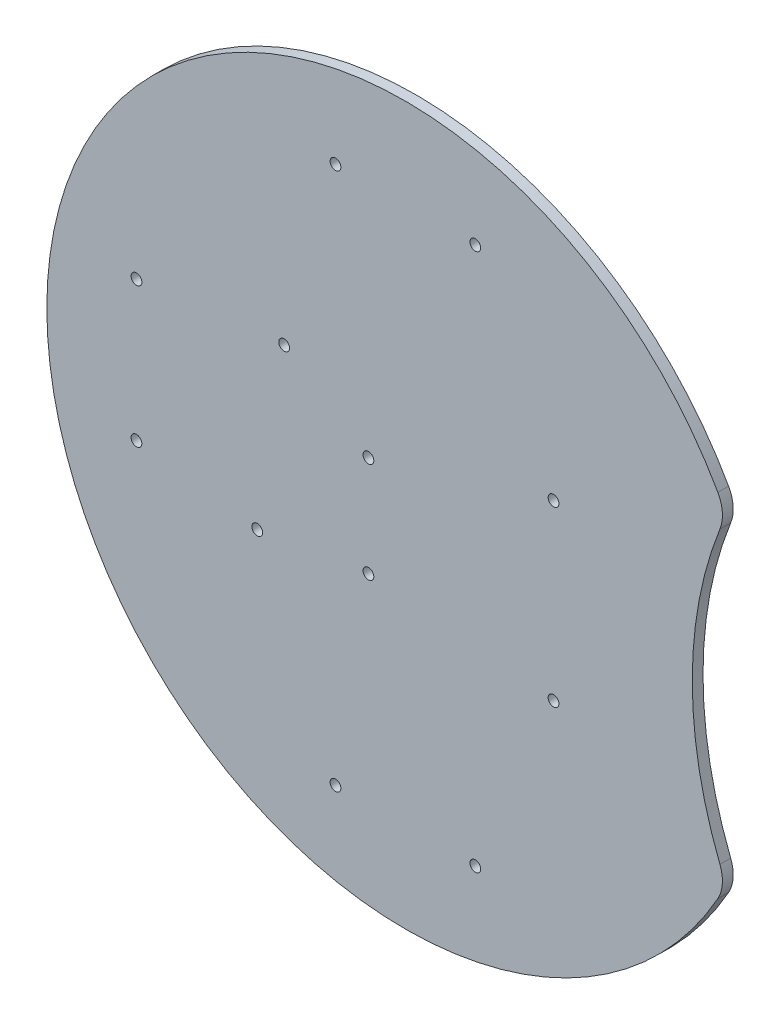
ISO-10303-21;
HEADER;
FILE_DESCRIPTION(('STEP AP214'),'2;1');
FILE_NAME('part.step','',(''),(''),'','','');
FILE_SCHEMA(('AUTOMOTIVE_DESIGN { 1 0 10303 214 1 1 1 1 }'));
ENDSEC;
DATA;
#1=APPLICATION_CONTEXT('core data for automotive mechanical design processes');
#2=APPLICATION_PROTOCOL_DEFINITION('international standard','automotive_design',2000,#1);
#3=PRODUCT_CONTEXT('',#1,'mechanical');
#4=PRODUCT('Part','Part','',(#3));
#5=PRODUCT_RELATED_PRODUCT_CATEGORY('part','',(#4));
#6=PRODUCT_DEFINITION_FORMATION('','',#4);
#7=PRODUCT_DEFINITION_CONTEXT('part definition',#1,'design');
#8=PRODUCT_DEFINITION('design','',#6,#7);
#9=PRODUCT_DEFINITION_SHAPE('','',#8);
#10=(LENGTH_UNIT() NAMED_UNIT(*) SI_UNIT(.MILLI.,.METRE.));
#11=(NAMED_UNIT(*) PLANE_ANGLE_UNIT() SI_UNIT($,.RADIAN.));
#12=(NAMED_UNIT(*) SI_UNIT($,.STERADIAN.) SOLID_ANGLE_UNIT());
#13=UNCERTAINTY_MEASURE_WITH_UNIT(LENGTH_MEASURE(1.E-05),#10,'distance_accuracy_value','');
#14=(GEOMETRIC_REPRESENTATION_CONTEXT(3) GLOBAL_UNCERTAINTY_ASSIGNED_CONTEXT((#13)) GLOBAL_UNIT_ASSIGNED_CONTEXT((#10,
#11,#12)) REPRESENTATION_CONTEXT('',''));
#15=CARTESIAN_POINT('',(0.,0.,0.));
#16=DIRECTION('',(0.,0.,1.));
#17=DIRECTION('',(1.,0.,0.));
#18=AXIS2_PLACEMENT_3D('',#15,#16,#17);
#19=CARTESIAN_POINT('',(0.,0.,3.));
#20=DIRECTION('',(0.,0.,-1.));
#21=DIRECTION('',(-1.,0.,0.));
#22=AXIS2_PLACEMENT_3D('',#19,#20,#21);
#23=CYLINDRICAL_SURFACE('',#22,100.);
#24=CARTESIAN_POINT('',(0.,0.,0.));
#25=DIRECTION('',(0.,0.,1.));
#26=DIRECTION('',(1.,0.,0.));
#27=AXIS2_PLACEMENT_3D('',#24,#25,#26);
#28=CIRCLE('',#27,100.);
#29=CARTESIAN_POINT('',(87.1345029239766,49.0670806161475,0.));
#30=VERTEX_POINT('',#29);
#31=CARTESIAN_POINT('',(87.1345029239766,-49.0670806161475,0.));
#32=VERTEX_POINT('',#31);
#33=EDGE_CURVE('E83',#30,#32,#28,.T.);
#34=ORIENTED_EDGE('',*,*,#33,.T.);
#35=DIRECTION('',(0.,0.,-1.));
#36=VECTOR('',#35,1.);
#37=CARTESIAN_POINT('',(87.1345029239766,-49.0670806161475,3.));
#38=LINE('',#37,#36);
#39=CARTESIAN_POINT('',(87.1345029239766,-49.0670806161475,3.));
#40=VERTEX_POINT('',#39);
#41=EDGE_CURVE('E87',#32,#40,#38,.F.);
#42=ORIENTED_EDGE('',*,*,#41,.T.);
#43=CARTESIAN_POINT('',(0.,0.,3.));
#44=DIRECTION('',(0.,0.,1.));
#45=DIRECTION('',(1.,0.,0.));
#46=AXIS2_PLACEMENT_3D('',#43,#44,#45);
#47=CIRCLE('',#46,100.);
#48=CARTESIAN_POINT('',(87.1345029239766,49.0670806161475,3.));
#49=VERTEX_POINT('',#48);
#50=EDGE_CURVE('E86',#49,#40,#47,.T.);
#51=ORIENTED_EDGE('',*,*,#50,.F.);
#52=DIRECTION('',(0.,0.,-1.));
#53=VECTOR('',#52,1.);
#54=CARTESIAN_POINT('',(87.1345029239766,49.0670806161475,3.));
#55=LINE('',#54,#53);
#56=EDGE_CURVE('E77',#49,#30,#55,.T.);
#57=ORIENTED_EDGE('',*,*,#56,.T.);
#58=EDGE_LOOP('',(#34,#42,#51,#57));
#59=FACE_BOUND('',#58,.T.);
#60=ADVANCED_FACE('F35',(#59),#23,.T.);
#61=CARTESIAN_POINT('',(0.,0.,3.));
#62=DIRECTION('',(0.,0.,1.));
#63=DIRECTION('',(1.,0.,0.));
#64=AXIS2_PLACEMENT_3D('',#61,#62,#63);
#65=PLANE('',#64);
#66=CARTESIAN_POINT('',(19.5000000000062,-74.999999999996,3.));
#67=DIRECTION('',(0.,0.,1.));
#68=DIRECTION('',(1.,0.,0.));
#69=AXIS2_PLACEMENT_3D('',#66,#67,#68);
#70=CIRCLE('',#69,1.5);
#71=CARTESIAN_POINT('',(21.0000000000062,-74.999999999996,3.));
#72=VERTEX_POINT('',#71);
#73=EDGE_CURVE('E176',#72,#72,#70,.T.);
#74=ORIENTED_EDGE('',*,*,#73,.F.);
#75=EDGE_LOOP('',(#74));
#76=FACE_BOUND('',#75,.T.);
#77=CARTESIAN_POINT('',(-19.4999999999938,-74.999999999996,3.));
#78=DIRECTION('',(0.,0.,1.));
#79=DIRECTION('',(1.,0.,0.));
#80=AXIS2_PLACEMENT_3D('',#77,#78,#79);
#81=CIRCLE('',#80,1.5);
#82=CARTESIAN_POINT('',(-17.9999999999938,-74.999999999996,3.));
#83=VERTEX_POINT('',#82);
#84=EDGE_CURVE('E170',#83,#83,#81,.T.);
#85=ORIENTED_EDGE('',*,*,#84,.F.);
#86=EDGE_LOOP('',(#85));
#87=FACE_BOUND('',#86,.T.);
#88=CARTESIAN_POINT('',(-19.500000000004,75.0000000000062,3.));
#89=DIRECTION('',(0.,0.,1.));
#90=DIRECTION('',(1.,0.,0.));
#91=AXIS2_PLACEMENT_3D('',#88,#89,#90);
#92=CIRCLE('',#91,1.5);
#93=CARTESIAN_POINT('',(-18.000000000004,75.0000000000062,3.));
#94=VERTEX_POINT('',#93);
#95=EDGE_CURVE('E164',#94,#94,#92,.T.);
#96=ORIENTED_EDGE('',*,*,#95,.F.);
#97=EDGE_LOOP('',(#96));
#98=FACE_BOUND('',#97,.T.);
#99=CARTESIAN_POINT('',(19.499999999996,75.0000000000062,3.));
#100=DIRECTION('',(0.,0.,1.));
#101=DIRECTION('',(1.,0.,0.));
#102=AXIS2_PLACEMENT_3D('',#99,#100,#101);
#103=CIRCLE('',#102,1.5);
#104=CARTESIAN_POINT('',(20.999999999996,75.0000000000062,3.));
#105=VERTEX_POINT('',#104);
#106=EDGE_CURVE('E158',#105,#105,#103,.T.);
#107=ORIENTED_EDGE('',*,*,#106,.F.);
#108=EDGE_LOOP('',(#107));
#109=FACE_BOUND('',#108,.T.);
#110=CARTESIAN_POINT('',(-75.,-19.5,3.));
#111=DIRECTION('',(0.,0.,1.));
#112=DIRECTION('',(1.,0.,0.));
#113=AXIS2_PLACEMENT_3D('',#110,#111,#112);
#114=CIRCLE('',#113,1.5);
#115=CARTESIAN_POINT('',(-73.5,-19.5,3.));
#116=VERTEX_POINT('',#115);
#117=EDGE_CURVE('E152',#116,#116,#114,.T.);
#118=ORIENTED_EDGE('',*,*,#117,.F.);
#119=EDGE_LOOP('',(#118));
#120=FACE_BOUND('',#119,.T.);
#121=CARTESIAN_POINT('',(-75.,19.5,3.));
#122=DIRECTION('',(0.,0.,1.));
#123=DIRECTION('',(1.,0.,0.));
#124=AXIS2_PLACEMENT_3D('',#121,#122,#123);
#125=CIRCLE('',#124,1.5);
#126=CARTESIAN_POINT('',(-73.5,19.5,3.));
#127=VERTEX_POINT('',#126);
#128=EDGE_CURVE('E146',#127,#127,#125,.T.);
#129=ORIENTED_EDGE('',*,*,#128,.F.);
#130=EDGE_LOOP('',(#129));
#131=FACE_BOUND('',#130,.T.);
#132=CARTESIAN_POINT('',(-10.3111952615467,8.71464290879509,3.));
#133=DIRECTION('',(0.,0.,1.));
#134=DIRECTION('',(1.,0.,0.));
#135=AXIS2_PLACEMENT_3D('',#132,#133,#134);
#136=CIRCLE('',#135,1.5);
#137=CARTESIAN_POINT('',(-8.81119526154665,8.71464290879509,3.));
#138=VERTEX_POINT('',#137);
#139=EDGE_CURVE('E140',#138,#138,#136,.T.);
#140=ORIENTED_EDGE('',*,*,#139,.F.);
#141=EDGE_LOOP('',(#140));
#142=FACE_BOUND('',#141,.T.);
#143=CARTESIAN_POINT('',(-10.3155948202832,-19.297497716394,3.));
#144=DIRECTION('',(0.,0.,1.));
#145=DIRECTION('',(1.,0.,0.));
#146=AXIS2_PLACEMENT_3D('',#143,#144,#145);
#147=CIRCLE('',#146,1.5);
#148=CARTESIAN_POINT('',(-8.81559482028319,-19.297497716394,3.));
#149=VERTEX_POINT('',#148);
#150=EDGE_CURVE('E134',#149,#149,#147,.T.);
#151=ORIENTED_EDGE('',*,*,#150,.F.);
#152=EDGE_LOOP('',(#151));
#153=FACE_BOUND('',#152,.T.);
#154=CARTESIAN_POINT('',(41.315,24.17,3.));
#155=DIRECTION('',(0.,0.,1.));
#156=DIRECTION('',(1.,0.,0.));
#157=AXIS2_PLACEMENT_3D('',#154,#155,#156);
#158=CIRCLE('',#157,1.5);
#159=CARTESIAN_POINT('',(42.815,24.17,3.));
#160=VERTEX_POINT('',#159);
#161=EDGE_CURVE('E128',#160,#160,#158,.T.);
#162=ORIENTED_EDGE('',*,*,#161,.F.);
#163=EDGE_LOOP('',(#162));
#164=FACE_BOUND('',#163,.T.);
#165=CARTESIAN_POINT('',(41.315,-24.17,3.));
#166=DIRECTION('',(0.,0.,1.));
#167=DIRECTION('',(1.,0.,0.));
#168=AXIS2_PLACEMENT_3D('',#165,#166,#167);
#169=CIRCLE('',#168,1.5);
#170=CARTESIAN_POINT('',(42.815,-24.17,3.));
#171=VERTEX_POINT('',#170);
#172=EDGE_CURVE('E122',#171,#171,#169,.T.);
#173=ORIENTED_EDGE('',*,*,#172,.F.);
#174=EDGE_LOOP('',(#173));
#175=FACE_BOUND('',#174,.T.);
#176=CARTESIAN_POINT('',(-41.315,-24.17,3.));
#177=DIRECTION('',(0.,0.,1.));
#178=DIRECTION('',(1.,0.,0.));
#179=AXIS2_PLACEMENT_3D('',#176,#177,#178);
#180=CIRCLE('',#179,1.5);
#181=CARTESIAN_POINT('',(-39.815,-24.17,3.));
#182=VERTEX_POINT('',#181);
#183=EDGE_CURVE('E116',#182,#182,#180,.T.);
#184=ORIENTED_EDGE('',*,*,#183,.F.);
#185=EDGE_LOOP('',(#184));
#186=FACE_BOUND('',#185,.T.);
#187=CARTESIAN_POINT('',(-33.815,24.17,3.));
#188=DIRECTION('',(0.,0.,1.));
#189=DIRECTION('',(1.,0.,0.));
#190=AXIS2_PLACEMENT_3D('',#187,#188,#189);
#191=CIRCLE('',#190,1.5);
#192=CARTESIAN_POINT('',(-32.315,24.17,3.));
#193=VERTEX_POINT('',#192);
#194=EDGE_CURVE('E110',#193,#193,#191,.T.);
#195=ORIENTED_EDGE('',*,*,#194,.F.);
#196=EDGE_LOOP('',(#195));
#197=FACE_BOUND('',#196,.T.);
#198=ORIENTED_EDGE('',*,*,#50,.T.);
#199=CARTESIAN_POINT('',(78.4210526315789,-44.1603725545327,3.));
#200=DIRECTION('',(0.,0.,1.));
#201=DIRECTION('',(1.,0.,0.));
#202=AXIS2_PLACEMENT_3D('',#199,#200,#201);
#203=CIRCLE('',#202,10.);
#204=CARTESIAN_POINT('',(87.719298245614,-40.4803415083217,3.));
#205=VERTEX_POINT('',#204);
#206=EDGE_CURVE('E101',#40,#205,#203,.T.);
#207=ORIENTED_EDGE('',*,*,#206,.T.);
#208=CARTESIAN_POINT('',(190.,0.,3.));
#209=DIRECTION('',(0.,0.,1.));
#210=DIRECTION('',(1.,0.,0.));
#211=AXIS2_PLACEMENT_3D('',#208,#209,#210);
#212=CIRCLE('',#211,110.);
#213=CARTESIAN_POINT('',(87.719298245614,40.4803415083217,3.));
#214=VERTEX_POINT('',#213);
#215=EDGE_CURVE('E94',#214,#205,#212,.T.);
#216=ORIENTED_EDGE('',*,*,#215,.F.);
#217=CARTESIAN_POINT('',(78.4210526315789,44.1603725545327,3.));
#218=DIRECTION('',(0.,0.,1.));
#219=DIRECTION('',(1.,0.,0.));
#220=AXIS2_PLACEMENT_3D('',#217,#218,#219);
#221=CIRCLE('',#220,10.);
#222=EDGE_CURVE('E99',#214,#49,#221,.T.);
#223=ORIENTED_EDGE('',*,*,#222,.T.);
#224=EDGE_LOOP('',(#198,#207,#216,#223));
#225=FACE_BOUND('',#224,.T.);
#226=ADVANCED_FACE('F107',(#76,#87,#98,#109,#120,#131,#142,#153,#164,#175,#186,#197,#225),#65,.T.);
#227=CARTESIAN_POINT('',(0.,0.,0.));
#228=DIRECTION('',(0.,0.,1.));
#229=DIRECTION('',(1.,0.,0.));
#230=AXIS2_PLACEMENT_3D('',#227,#228,#229);
#231=PLANE('',#230);
#232=CARTESIAN_POINT('',(19.5000000000062,-74.999999999996,0.));
#233=DIRECTION('',(0.,0.,1.));
#234=DIRECTION('',(1.,0.,0.));
#235=AXIS2_PLACEMENT_3D('',#232,#233,#234);
#236=CIRCLE('',#235,1.5);
#237=CARTESIAN_POINT('',(21.0000000000062,-74.999999999996,0.));
#238=VERTEX_POINT('',#237);
#239=EDGE_CURVE('E173',#238,#238,#236,.T.);
#240=ORIENTED_EDGE('',*,*,#239,.T.);
#241=EDGE_LOOP('',(#240));
#242=FACE_BOUND('',#241,.T.);
#243=CARTESIAN_POINT('',(-19.4999999999938,-74.999999999996,0.));
#244=DIRECTION('',(0.,0.,1.));
#245=DIRECTION('',(1.,0.,0.));
#246=AXIS2_PLACEMENT_3D('',#243,#244,#245);
#247=CIRCLE('',#246,1.5);
#248=CARTESIAN_POINT('',(-17.9999999999938,-74.999999999996,0.));
#249=VERTEX_POINT('',#248);
#250=EDGE_CURVE('E167',#249,#249,#247,.T.);
#251=ORIENTED_EDGE('',*,*,#250,.T.);
#252=EDGE_LOOP('',(#251));
#253=FACE_BOUND('',#252,.T.);
#254=CARTESIAN_POINT('',(-19.500000000004,75.0000000000062,0.));
#255=DIRECTION('',(0.,0.,1.));
#256=DIRECTION('',(1.,0.,0.));
#257=AXIS2_PLACEMENT_3D('',#254,#255,#256);
#258=CIRCLE('',#257,1.5);
#259=CARTESIAN_POINT('',(-18.000000000004,75.0000000000062,0.));
#260=VERTEX_POINT('',#259);
#261=EDGE_CURVE('E161',#260,#260,#258,.T.);
#262=ORIENTED_EDGE('',*,*,#261,.T.);
#263=EDGE_LOOP('',(#262));
#264=FACE_BOUND('',#263,.T.);
#265=CARTESIAN_POINT('',(19.499999999996,75.0000000000062,0.));
#266=DIRECTION('',(0.,0.,1.));
#267=DIRECTION('',(1.,0.,0.));
#268=AXIS2_PLACEMENT_3D('',#265,#266,#267);
#269=CIRCLE('',#268,1.5);
#270=CARTESIAN_POINT('',(20.999999999996,75.0000000000062,0.));
#271=VERTEX_POINT('',#270);
#272=EDGE_CURVE('E155',#271,#271,#269,.T.);
#273=ORIENTED_EDGE('',*,*,#272,.T.);
#274=EDGE_LOOP('',(#273));
#275=FACE_BOUND('',#274,.T.);
#276=CARTESIAN_POINT('',(-75.,-19.5,0.));
#277=DIRECTION('',(0.,0.,1.));
#278=DIRECTION('',(1.,0.,0.));
#279=AXIS2_PLACEMENT_3D('',#276,#277,#278);
#280=CIRCLE('',#279,1.5);
#281=CARTESIAN_POINT('',(-73.5,-19.5,0.));
#282=VERTEX_POINT('',#281);
#283=EDGE_CURVE('E149',#282,#282,#280,.T.);
#284=ORIENTED_EDGE('',*,*,#283,.T.);
#285=EDGE_LOOP('',(#284));
#286=FACE_BOUND('',#285,.T.);
#287=CARTESIAN_POINT('',(-75.,19.5,0.));
#288=DIRECTION('',(0.,0.,1.));
#289=DIRECTION('',(1.,0.,0.));
#290=AXIS2_PLACEMENT_3D('',#287,#288,#289);
#291=CIRCLE('',#290,1.5);
#292=CARTESIAN_POINT('',(-73.5,19.5,0.));
#293=VERTEX_POINT('',#292);
#294=EDGE_CURVE('E143',#293,#293,#291,.T.);
#295=ORIENTED_EDGE('',*,*,#294,.T.);
#296=EDGE_LOOP('',(#295));
#297=FACE_BOUND('',#296,.T.);
#298=CARTESIAN_POINT('',(-10.3111952615467,8.71464290879509,0.));
#299=DIRECTION('',(0.,0.,1.));
#300=DIRECTION('',(1.,0.,0.));
#301=AXIS2_PLACEMENT_3D('',#298,#299,#300);
#302=CIRCLE('',#301,1.5);
#303=CARTESIAN_POINT('',(-8.81119526154665,8.71464290879509,0.));
#304=VERTEX_POINT('',#303);
#305=EDGE_CURVE('E137',#304,#304,#302,.T.);
#306=ORIENTED_EDGE('',*,*,#305,.T.);
#307=EDGE_LOOP('',(#306));
#308=FACE_BOUND('',#307,.T.);
#309=CARTESIAN_POINT('',(-10.3155948202832,-19.297497716394,0.));
#310=DIRECTION('',(0.,0.,1.));
#311=DIRECTION('',(1.,0.,0.));
#312=AXIS2_PLACEMENT_3D('',#309,#310,#311);
#313=CIRCLE('',#312,1.5);
#314=CARTESIAN_POINT('',(-8.81559482028319,-19.297497716394,0.));
#315=VERTEX_POINT('',#314);
#316=EDGE_CURVE('E131',#315,#315,#313,.T.);
#317=ORIENTED_EDGE('',*,*,#316,.T.);
#318=EDGE_LOOP('',(#317));
#319=FACE_BOUND('',#318,.T.);
#320=CARTESIAN_POINT('',(41.315,24.17,0.));
#321=DIRECTION('',(0.,0.,1.));
#322=DIRECTION('',(1.,0.,0.));
#323=AXIS2_PLACEMENT_3D('',#320,#321,#322);
#324=CIRCLE('',#323,1.5);
#325=CARTESIAN_POINT('',(42.815,24.17,0.));
#326=VERTEX_POINT('',#325);
#327=EDGE_CURVE('E125',#326,#326,#324,.T.);
#328=ORIENTED_EDGE('',*,*,#327,.T.);
#329=EDGE_LOOP('',(#328));
#330=FACE_BOUND('',#329,.T.);
#331=CARTESIAN_POINT('',(41.315,-24.17,0.));
#332=DIRECTION('',(0.,0.,1.));
#333=DIRECTION('',(1.,0.,0.));
#334=AXIS2_PLACEMENT_3D('',#331,#332,#333);
#335=CIRCLE('',#334,1.5);
#336=CARTESIAN_POINT('',(42.815,-24.17,0.));
#337=VERTEX_POINT('',#336);
#338=EDGE_CURVE('E119',#337,#337,#335,.T.);
#339=ORIENTED_EDGE('',*,*,#338,.T.);
#340=EDGE_LOOP('',(#339));
#341=FACE_BOUND('',#340,.T.);
#342=CARTESIAN_POINT('',(-41.315,-24.17,0.));
#343=DIRECTION('',(0.,0.,1.));
#344=DIRECTION('',(1.,0.,0.));
#345=AXIS2_PLACEMENT_3D('',#342,#343,#344);
#346=CIRCLE('',#345,1.5);
#347=CARTESIAN_POINT('',(-39.815,-24.17,0.));
#348=VERTEX_POINT('',#347);
#349=EDGE_CURVE('E114',#348,#348,#346,.T.);
#350=ORIENTED_EDGE('',*,*,#349,.T.);
#351=EDGE_LOOP('',(#350));
#352=FACE_BOUND('',#351,.T.);
#353=CARTESIAN_POINT('',(-33.815,24.17,0.));
#354=DIRECTION('',(0.,0.,1.));
#355=DIRECTION('',(1.,0.,0.));
#356=AXIS2_PLACEMENT_3D('',#353,#354,#355);
#357=CIRCLE('',#356,1.5);
#358=CARTESIAN_POINT('',(-32.315,24.17,0.));
#359=VERTEX_POINT('',#358);
#360=EDGE_CURVE('E108',#359,#359,#357,.T.);
#361=ORIENTED_EDGE('',*,*,#360,.T.);
#362=EDGE_LOOP('',(#361));
#363=FACE_BOUND('',#362,.T.);
#364=CARTESIAN_POINT('',(190.,0.,0.));
#365=DIRECTION('',(0.,0.,1.));
#366=DIRECTION('',(1.,0.,0.));
#367=AXIS2_PLACEMENT_3D('',#364,#365,#366);
#368=CIRCLE('',#367,110.);
#369=CARTESIAN_POINT('',(87.719298245614,40.4803415083217,0.));
#370=VERTEX_POINT('',#369);
#371=CARTESIAN_POINT('',(87.719298245614,-40.4803415083217,0.));
#372=VERTEX_POINT('',#371);
#373=EDGE_CURVE('E91',#370,#372,#368,.T.);
#374=ORIENTED_EDGE('',*,*,#373,.T.);
#375=CARTESIAN_POINT('',(78.4210526315789,-44.1603725545327,0.));
#376=DIRECTION('',(0.,0.,1.));
#377=DIRECTION('',(1.,0.,0.));
#378=AXIS2_PLACEMENT_3D('',#375,#376,#377);
#379=CIRCLE('',#378,10.);
#380=EDGE_CURVE('E11',#372,#32,#379,.F.);
#381=ORIENTED_EDGE('',*,*,#380,.T.);
#382=ORIENTED_EDGE('',*,*,#33,.F.);
#383=CARTESIAN_POINT('',(78.4210526315789,44.1603725545327,0.));
#384=DIRECTION('',(0.,0.,1.));
#385=DIRECTION('',(1.,0.,0.));
#386=AXIS2_PLACEMENT_3D('',#383,#384,#385);
#387=CIRCLE('',#386,10.);
#388=EDGE_CURVE('E43',#30,#370,#387,.F.);
#389=ORIENTED_EDGE('',*,*,#388,.T.);
#390=EDGE_LOOP('',(#374,#381,#382,#389));
#391=FACE_BOUND('',#390,.T.);
#392=ADVANCED_FACE('F89',(#242,#253,#264,#275,#286,#297,#308,#319,#330,#341,#352,#363,#391),
#231,.F.);
#393=CARTESIAN_POINT('',(190.,0.,0.));
#394=DIRECTION('',(0.,0.,1.));
#395=DIRECTION('',(1.,0.,0.));
#396=AXIS2_PLACEMENT_3D('',#393,#394,#395);
#397=CYLINDRICAL_SURFACE('',#396,110.);
#398=ORIENTED_EDGE('',*,*,#215,.T.);
#399=DIRECTION('',(0.,0.,1.));
#400=VECTOR('',#399,1.);
#401=CARTESIAN_POINT('',(87.719298245614,-40.4803415083217,0.));
#402=LINE('',#401,#400);
#403=EDGE_CURVE('E50',#205,#372,#402,.F.);
#404=ORIENTED_EDGE('',*,*,#403,.T.);
#405=ORIENTED_EDGE('',*,*,#373,.F.);
#406=DIRECTION('',(0.,0.,1.));
#407=VECTOR('',#406,1.);
#408=CARTESIAN_POINT('',(87.719298245614,40.4803415083217,0.));
#409=LINE('',#408,#407);
#410=EDGE_CURVE('E78',#370,#214,#409,.T.);
#411=ORIENTED_EDGE('',*,*,#410,.T.);
#412=EDGE_LOOP('',(#398,#404,#405,#411));
#413=FACE_BOUND('',#412,.T.);
#414=ADVANCED_FACE('F105',(#413),#397,.F.);
#415=CARTESIAN_POINT('',(78.4210526315789,-44.1603725545327,0.));
#416=DIRECTION('',(0.,0.,-1.));
#417=DIRECTION('',(-1.,0.,0.));
#418=AXIS2_PLACEMENT_3D('',#415,#416,#417);
#419=CYLINDRICAL_SURFACE('',#418,10.);
#420=ORIENTED_EDGE('',*,*,#380,.F.);
#421=ORIENTED_EDGE('',*,*,#403,.F.);
#422=ORIENTED_EDGE('',*,*,#206,.F.);
#423=ORIENTED_EDGE('',*,*,#41,.F.);
#424=EDGE_LOOP('',(#420,#421,#422,#423));
#425=FACE_BOUND('',#424,.T.);
#426=ADVANCED_FACE('F228',(#425),#419,.T.);
#427=CARTESIAN_POINT('',(78.4210526315789,44.1603725545327,0.));
#428=DIRECTION('',(0.,0.,1.));
#429=DIRECTION('',(1.,0.,0.));
#430=AXIS2_PLACEMENT_3D('',#427,#428,#429);
#431=CYLINDRICAL_SURFACE('',#430,10.);
#432=ORIENTED_EDGE('',*,*,#222,.F.);
#433=ORIENTED_EDGE('',*,*,#410,.F.);
#434=ORIENTED_EDGE('',*,*,#388,.F.);
#435=ORIENTED_EDGE('',*,*,#56,.F.);
#436=EDGE_LOOP('',(#432,#433,#434,#435));
#437=FACE_BOUND('',#436,.T.);
#438=ADVANCED_FACE('F37',(#437),#431,.T.);
#439=CARTESIAN_POINT('',(-33.815,24.17,0.));
#440=DIRECTION('',(0.,0.,1.));
#441=DIRECTION('',(1.,0.,0.));
#442=AXIS2_PLACEMENT_3D('',#439,#440,#441);
#443=CYLINDRICAL_SURFACE('',#442,1.5);
#444=ORIENTED_EDGE('',*,*,#360,.F.);
#445=EDGE_LOOP('',(#444));
#446=FACE_BOUND('',#445,.T.);
#447=ORIENTED_EDGE('',*,*,#194,.T.);
#448=EDGE_LOOP('',(#447));
#449=FACE_BOUND('',#448,.T.);
#450=ADVANCED_FACE('F216',(#446,#449),#443,.F.);
#451=CARTESIAN_POINT('',(-41.315,-24.17,0.));
#452=DIRECTION('',(0.,0.,1.));
#453=DIRECTION('',(1.,0.,0.));
#454=AXIS2_PLACEMENT_3D('',#451,#452,#453);
#455=CYLINDRICAL_SURFACE('',#454,1.5);
#456=ORIENTED_EDGE('',*,*,#349,.F.);
#457=EDGE_LOOP('',(#456));
#458=FACE_BOUND('',#457,.T.);
#459=ORIENTED_EDGE('',*,*,#183,.T.);
#460=EDGE_LOOP('',(#459));
#461=FACE_BOUND('',#460,.T.);
#462=ADVANCED_FACE('F218',(#458,#461),#455,.F.);
#463=CARTESIAN_POINT('',(41.315,-24.17,0.));
#464=DIRECTION('',(0.,0.,1.));
#465=DIRECTION('',(1.,0.,0.));
#466=AXIS2_PLACEMENT_3D('',#463,#464,#465);
#467=CYLINDRICAL_SURFACE('',#466,1.5);
#468=ORIENTED_EDGE('',*,*,#338,.F.);
#469=EDGE_LOOP('',(#468));
#470=FACE_BOUND('',#469,.T.);
#471=ORIENTED_EDGE('',*,*,#172,.T.);
#472=EDGE_LOOP('',(#471));
#473=FACE_BOUND('',#472,.T.);
#474=ADVANCED_FACE('F225',(#470,#473),#467,.F.);
#475=CARTESIAN_POINT('',(41.315,24.17,0.));
#476=DIRECTION('',(0.,0.,1.));
#477=DIRECTION('',(1.,0.,0.));
#478=AXIS2_PLACEMENT_3D('',#475,#476,#477);
#479=CYLINDRICAL_SURFACE('',#478,1.5);
#480=ORIENTED_EDGE('',*,*,#327,.F.);
#481=EDGE_LOOP('',(#480));
#482=FACE_BOUND('',#481,.T.);
#483=ORIENTED_EDGE('',*,*,#161,.T.);
#484=EDGE_LOOP('',(#483));
#485=FACE_BOUND('',#484,.T.);
#486=ADVANCED_FACE('F317',(#482,#485),#479,.F.);
#487=CARTESIAN_POINT('',(-10.3155948202832,-19.297497716394,0.));
#488=DIRECTION('',(0.,0.,1.));
#489=DIRECTION('',(1.,0.,0.));
#490=AXIS2_PLACEMENT_3D('',#487,#488,#489);
#491=CYLINDRICAL_SURFACE('',#490,1.5);
#492=ORIENTED_EDGE('',*,*,#316,.F.);
#493=EDGE_LOOP('',(#492));
#494=FACE_BOUND('',#493,.T.);
#495=ORIENTED_EDGE('',*,*,#150,.T.);
#496=EDGE_LOOP('',(#495));
#497=FACE_BOUND('',#496,.T.);
#498=ADVANCED_FACE('F313',(#494,#497),#491,.F.);
#499=CARTESIAN_POINT('',(-10.3111952615467,8.71464290879509,0.));
#500=DIRECTION('',(0.,0.,1.));
#501=DIRECTION('',(1.,0.,0.));
#502=AXIS2_PLACEMENT_3D('',#499,#500,#501);
#503=CYLINDRICAL_SURFACE('',#502,1.5);
#504=ORIENTED_EDGE('',*,*,#305,.F.);
#505=EDGE_LOOP('',(#504));
#506=FACE_BOUND('',#505,.T.);
#507=ORIENTED_EDGE('',*,*,#139,.T.);
#508=EDGE_LOOP('',(#507));
#509=FACE_BOUND('',#508,.T.);
#510=ADVANCED_FACE('F258',(#506,#509),#503,.F.);
#511=CARTESIAN_POINT('',(-75.,19.5,0.));
#512=DIRECTION('',(0.,0.,1.));
#513=DIRECTION('',(1.,0.,0.));
#514=AXIS2_PLACEMENT_3D('',#511,#512,#513);
#515=CYLINDRICAL_SURFACE('',#514,1.5);
#516=ORIENTED_EDGE('',*,*,#294,.F.);
#517=EDGE_LOOP('',(#516));
#518=FACE_BOUND('',#517,.T.);
#519=ORIENTED_EDGE('',*,*,#128,.T.);
#520=EDGE_LOOP('',(#519));
#521=FACE_BOUND('',#520,.T.);
#522=ADVANCED_FACE('F252',(#518,#521),#515,.F.);
#523=CARTESIAN_POINT('',(-75.,-19.5,0.));
#524=DIRECTION('',(0.,0.,1.));
#525=DIRECTION('',(1.,0.,0.));
#526=AXIS2_PLACEMENT_3D('',#523,#524,#525);
#527=CYLINDRICAL_SURFACE('',#526,1.5);
#528=ORIENTED_EDGE('',*,*,#283,.F.);
#529=EDGE_LOOP('',(#528));
#530=FACE_BOUND('',#529,.T.);
#531=ORIENTED_EDGE('',*,*,#117,.T.);
#532=EDGE_LOOP('',(#531));
#533=FACE_BOUND('',#532,.T.);
#534=ADVANCED_FACE('F257',(#530,#533),#527,.F.);
#535=CARTESIAN_POINT('',(19.499999999996,75.0000000000062,0.));
#536=DIRECTION('',(0.,0.,1.));
#537=DIRECTION('',(1.,0.,0.));
#538=AXIS2_PLACEMENT_3D('',#535,#536,#537);
#539=CYLINDRICAL_SURFACE('',#538,1.5);
#540=ORIENTED_EDGE('',*,*,#272,.F.);
#541=EDGE_LOOP('',(#540));
#542=FACE_BOUND('',#541,.T.);
#543=ORIENTED_EDGE('',*,*,#106,.T.);
#544=EDGE_LOOP('',(#543));
#545=FACE_BOUND('',#544,.T.);
#546=ADVANCED_FACE('F270',(#542,#545),#539,.F.);
#547=CARTESIAN_POINT('',(-19.500000000004,75.0000000000062,0.));
#548=DIRECTION('',(0.,0.,1.));
#549=DIRECTION('',(1.,0.,0.));
#550=AXIS2_PLACEMENT_3D('',#547,#548,#549);
#551=CYLINDRICAL_SURFACE('',#550,1.5);
#552=ORIENTED_EDGE('',*,*,#261,.F.);
#553=EDGE_LOOP('',(#552));
#554=FACE_BOUND('',#553,.T.);
#555=ORIENTED_EDGE('',*,*,#95,.T.);
#556=EDGE_LOOP('',(#555));
#557=FACE_BOUND('',#556,.T.);
#558=ADVANCED_FACE('F280',(#554,#557),#551,.F.);
#559=CARTESIAN_POINT('',(-19.4999999999938,-74.999999999996,0.));
#560=DIRECTION('',(0.,0.,1.));
#561=DIRECTION('',(1.,0.,0.));
#562=AXIS2_PLACEMENT_3D('',#559,#560,#561);
#563=CYLINDRICAL_SURFACE('',#562,1.5);
#564=ORIENTED_EDGE('',*,*,#250,.F.);
#565=EDGE_LOOP('',(#564));
#566=FACE_BOUND('',#565,.T.);
#567=ORIENTED_EDGE('',*,*,#84,.T.);
#568=EDGE_LOOP('',(#567));
#569=FACE_BOUND('',#568,.T.);
#570=ADVANCED_FACE('F187',(#566,#569),#563,.F.);
#571=CARTESIAN_POINT('',(19.5000000000062,-74.999999999996,0.));
#572=DIRECTION('',(0.,0.,1.));
#573=DIRECTION('',(1.,0.,0.));
#574=AXIS2_PLACEMENT_3D('',#571,#572,#573);
#575=CYLINDRICAL_SURFACE('',#574,1.5);
#576=ORIENTED_EDGE('',*,*,#239,.F.);
#577=EDGE_LOOP('',(#576));
#578=FACE_BOUND('',#577,.T.);
#579=ORIENTED_EDGE('',*,*,#73,.T.);
#580=EDGE_LOOP('',(#579));
#581=FACE_BOUND('',#580,.T.);
#582=ADVANCED_FACE('F184',(#578,#581),#575,.F.);
#583=CLOSED_SHELL('',(#60,#226,#392,#414,#426,#438,#450,#462,#474,#486,#498,#510,#522,#534,#546,
#558,#570,#582));
#584=MANIFOLD_SOLID_BREP('B2',#583);
#585=ADVANCED_BREP_SHAPE_REPRESENTATION('',(#18,#584),#14);
#586=SHAPE_DEFINITION_REPRESENTATION(#9,#585);
ENDSEC;
END-ISO-10303-21;
